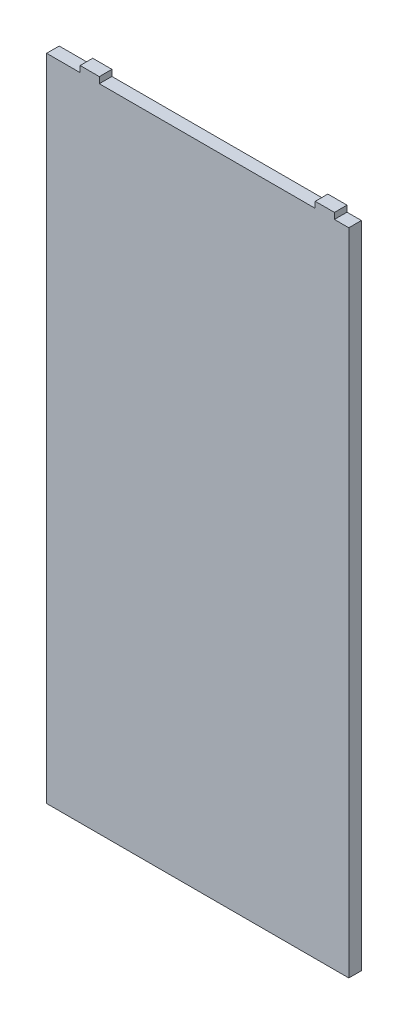
ISO-10303-21;
HEADER;
FILE_DESCRIPTION(('STEP AP214'),'2;1');
FILE_NAME('part.step','',(''),(''),'','','');
FILE_SCHEMA(('AUTOMOTIVE_DESIGN { 1 0 10303 214 1 1 1 1 }'));
ENDSEC;
DATA;
#1=APPLICATION_CONTEXT('core data for automotive mechanical design processes');
#2=APPLICATION_PROTOCOL_DEFINITION('international standard','automotive_design',2000,#1);
#3=PRODUCT_CONTEXT('',#1,'mechanical');
#4=PRODUCT('Part','Part','',(#3));
#5=PRODUCT_RELATED_PRODUCT_CATEGORY('part','',(#4));
#6=PRODUCT_DEFINITION_FORMATION('','',#4);
#7=PRODUCT_DEFINITION_CONTEXT('part definition',#1,'design');
#8=PRODUCT_DEFINITION('design','',#6,#7);
#9=PRODUCT_DEFINITION_SHAPE('','',#8);
#10=(LENGTH_UNIT() NAMED_UNIT(*) SI_UNIT(.MILLI.,.METRE.));
#11=(NAMED_UNIT(*) PLANE_ANGLE_UNIT() SI_UNIT($,.RADIAN.));
#12=(NAMED_UNIT(*) SI_UNIT($,.STERADIAN.) SOLID_ANGLE_UNIT());
#13=UNCERTAINTY_MEASURE_WITH_UNIT(LENGTH_MEASURE(1.E-05),#10,'distance_accuracy_value','');
#14=(GEOMETRIC_REPRESENTATION_CONTEXT(3) GLOBAL_UNCERTAINTY_ASSIGNED_CONTEXT((#13)) GLOBAL_UNIT_ASSIGNED_CONTEXT((#10,
#11,#12)) REPRESENTATION_CONTEXT('',''));
#15=CARTESIAN_POINT('',(0.,0.,0.));
#16=DIRECTION('',(0.,0.,1.));
#17=DIRECTION('',(1.,0.,0.));
#18=AXIS2_PLACEMENT_3D('',#15,#16,#17);
#19=CARTESIAN_POINT('',(11.9856574683296,25.0529411764706,1.));
#20=DIRECTION('',(0.,-1.,0.));
#21=DIRECTION('',(0.,0.,-1.));
#22=AXIS2_PLACEMENT_3D('',#19,#20,#21);
#23=PLANE('',#22);
#24=DIRECTION('',(-1.,0.,0.));
#25=VECTOR('',#24,1.);
#26=CARTESIAN_POINT('',(11.9856574683296,25.0529411764706,1.));
#27=LINE('',#26,#25);
#28=CARTESIAN_POINT('',(9.31924971913157,25.0529411764706,1.));
#29=VERTEX_POINT('',#28);
#30=CARTESIAN_POINT('',(-7.8277832132447,25.0529411764706,1.));
#31=VERTEX_POINT('',#30);
#32=EDGE_CURVE('E56',#29,#31,#27,.T.);
#33=ORIENTED_EDGE('',*,*,#32,.F.);
#34=DIRECTION('',(0.,0.,-1.));
#35=VECTOR('',#34,1.);
#36=CARTESIAN_POINT('',(9.31924971913157,25.0529411764706,1.));
#37=LINE('',#36,#35);
#38=CARTESIAN_POINT('',(9.31924971913157,25.0529411764706,0.));
#39=VERTEX_POINT('',#38);
#40=EDGE_CURVE('E160',#29,#39,#37,.T.);
#41=ORIENTED_EDGE('',*,*,#40,.T.);
#42=DIRECTION('',(-1.,0.,0.));
#43=VECTOR('',#42,1.);
#44=CARTESIAN_POINT('',(11.9856574683296,25.0529411764706,0.));
#45=LINE('',#44,#43);
#46=CARTESIAN_POINT('',(-7.8277832132447,25.0529411764706,0.));
#47=VERTEX_POINT('',#46);
#48=EDGE_CURVE('E149',#39,#47,#45,.T.);
#49=ORIENTED_EDGE('',*,*,#48,.T.);
#50=DIRECTION('',(0.,0.,1.));
#51=VECTOR('',#50,1.);
#52=CARTESIAN_POINT('',(-7.8277832132447,25.0529411764706,1.));
#53=LINE('',#52,#51);
#54=EDGE_CURVE('E200',#47,#31,#53,.T.);
#55=ORIENTED_EDGE('',*,*,#54,.T.);
#56=EDGE_LOOP('',(#33,#41,#49,#55));
#57=FACE_BOUND('',#56,.T.);
#58=ADVANCED_FACE('F33',(#57),#23,.F.);
#59=CARTESIAN_POINT('',(-9.3523252032447,25.0529411764706,1.));
#60=VERTEX_POINT('',#59);
#61=CARTESIAN_POINT('',(-12.0143425316704,25.0529411764706,1.));
#62=VERTEX_POINT('',#61);
#63=EDGE_CURVE('E209',#60,#62,#27,.T.);
#64=ORIENTED_EDGE('',*,*,#63,.F.);
#65=DIRECTION('',(0.,0.,-1.));
#66=VECTOR('',#65,1.);
#67=CARTESIAN_POINT('',(-9.3523252032447,25.0529411764706,1.));
#68=LINE('',#67,#66);
#69=CARTESIAN_POINT('',(-9.3523252032447,25.0529411764706,0.));
#70=VERTEX_POINT('',#69);
#71=EDGE_CURVE('E203',#60,#70,#68,.T.);
#72=ORIENTED_EDGE('',*,*,#71,.T.);
#73=CARTESIAN_POINT('',(-12.0143425316704,25.0529411764706,0.));
#74=VERTEX_POINT('',#73);
#75=EDGE_CURVE('E151',#70,#74,#45,.T.);
#76=ORIENTED_EDGE('',*,*,#75,.T.);
#77=DIRECTION('',(0.,0.,-1.));
#78=VECTOR('',#77,1.);
#79=CARTESIAN_POINT('',(-12.0143425316704,25.0529411764706,1.));
#80=LINE('',#79,#78);
#81=EDGE_CURVE('E41',#62,#74,#80,.T.);
#82=ORIENTED_EDGE('',*,*,#81,.F.);
#83=EDGE_LOOP('',(#64,#72,#76,#82));
#84=FACE_BOUND('',#83,.T.);
#85=ADVANCED_FACE('F235',(#84),#23,.F.);
#86=CARTESIAN_POINT('',(11.9856574683296,25.0529411764706,0.));
#87=VERTEX_POINT('',#86);
#88=CARTESIAN_POINT('',(10.8437917091316,25.0529411764706,0.));
#89=VERTEX_POINT('',#88);
#90=EDGE_CURVE('E138',#87,#89,#45,.T.);
#91=ORIENTED_EDGE('',*,*,#90,.T.);
#92=DIRECTION('',(0.,0.,1.));
#93=VECTOR('',#92,1.);
#94=CARTESIAN_POINT('',(10.8437917091316,25.0529411764706,1.));
#95=LINE('',#94,#93);
#96=CARTESIAN_POINT('',(10.8437917091316,25.0529411764706,1.));
#97=VERTEX_POINT('',#96);
#98=EDGE_CURVE('E141',#89,#97,#95,.T.);
#99=ORIENTED_EDGE('',*,*,#98,.T.);
#100=CARTESIAN_POINT('',(11.9856574683296,25.0529411764706,1.));
#101=VERTEX_POINT('',#100);
#102=EDGE_CURVE('E206',#101,#97,#27,.T.);
#103=ORIENTED_EDGE('',*,*,#102,.F.);
#104=DIRECTION('',(0.,0.,-1.));
#105=VECTOR('',#104,1.);
#106=CARTESIAN_POINT('',(11.9856574683296,25.0529411764706,1.));
#107=LINE('',#106,#105);
#108=EDGE_CURVE('E144',#101,#87,#107,.T.);
#109=ORIENTED_EDGE('',*,*,#108,.T.);
#110=EDGE_LOOP('',(#91,#99,#103,#109));
#111=FACE_BOUND('',#110,.T.);
#112=ADVANCED_FACE('F35',(#111),#23,.F.);
#113=CARTESIAN_POINT('',(-12.0143425316704,25.0529411764706,1.));
#114=DIRECTION('',(1.,0.,0.));
#115=DIRECTION('',(0.,0.,-1.));
#116=AXIS2_PLACEMENT_3D('',#113,#114,#115);
#117=PLANE('',#116);
#118=DIRECTION('',(0.,-1.,0.));
#119=VECTOR('',#118,1.);
#120=CARTESIAN_POINT('',(-12.0143425316704,25.0529411764706,0.));
#121=LINE('',#120,#119);
#122=CARTESIAN_POINT('',(-12.0143425316704,-26.5470588235294,0.));
#123=VERTEX_POINT('',#122);
#124=EDGE_CURVE('E148',#74,#123,#121,.T.);
#125=ORIENTED_EDGE('',*,*,#124,.T.);
#126=DIRECTION('',(0.,0.,-1.));
#127=VECTOR('',#126,1.);
#128=CARTESIAN_POINT('',(-12.0143425316704,-26.5470588235294,1.));
#129=LINE('',#128,#127);
#130=CARTESIAN_POINT('',(-12.0143425316704,-26.5470588235294,1.));
#131=VERTEX_POINT('',#130);
#132=EDGE_CURVE('E225',#131,#123,#129,.T.);
#133=ORIENTED_EDGE('',*,*,#132,.F.);
#134=DIRECTION('',(0.,-1.,0.));
#135=VECTOR('',#134,1.);
#136=CARTESIAN_POINT('',(-12.0143425316704,25.0529411764706,1.));
#137=LINE('',#136,#135);
#138=EDGE_CURVE('E208',#62,#131,#137,.T.);
#139=ORIENTED_EDGE('',*,*,#138,.F.);
#140=ORIENTED_EDGE('',*,*,#81,.T.);
#141=EDGE_LOOP('',(#125,#133,#139,#140));
#142=FACE_BOUND('',#141,.T.);
#143=ADVANCED_FACE('F231',(#142),#117,.F.);
#144=CARTESIAN_POINT('',(-12.0143425316704,-26.5470588235294,1.));
#145=DIRECTION('',(0.,1.,0.));
#146=DIRECTION('',(0.,0.,1.));
#147=AXIS2_PLACEMENT_3D('',#144,#145,#146);
#148=PLANE('',#147);
#149=DIRECTION('',(-1.,0.,0.));
#150=VECTOR('',#149,1.);
#151=CARTESIAN_POINT('',(0.,-26.5470588235294,0.5));
#152=LINE('',#151,#150);
#153=CARTESIAN_POINT('',(3.3832846203628,-26.5470588235294,0.5));
#154=VERTEX_POINT('',#153);
#155=CARTESIAN_POINT('',(-3.54401457519976,-26.5470588235294,0.5));
#156=VERTEX_POINT('',#155);
#157=EDGE_CURVE('E275',#154,#156,#152,.T.);
#158=ORIENTED_EDGE('',*,*,#157,.F.);
#159=DIRECTION('',(0.,0.,-1.));
#160=VECTOR('',#159,1.);
#161=CARTESIAN_POINT('',(3.3832846203628,-26.5470588235294,0.5));
#162=LINE('',#161,#160);
#163=CARTESIAN_POINT('',(3.3832846203628,-26.5470588235294,0.));
#164=VERTEX_POINT('',#163);
#165=EDGE_CURVE('E72',#154,#164,#162,.T.);
#166=ORIENTED_EDGE('',*,*,#165,.T.);
#167=DIRECTION('',(1.,0.,0.));
#168=VECTOR('',#167,1.);
#169=CARTESIAN_POINT('',(-12.0143425316704,-26.5470588235294,0.));
#170=LINE('',#169,#168);
#171=CARTESIAN_POINT('',(11.9856574683296,-26.5470588235294,0.));
#172=VERTEX_POINT('',#171);
#173=EDGE_CURVE('E216',#164,#172,#170,.T.);
#174=ORIENTED_EDGE('',*,*,#173,.T.);
#175=DIRECTION('',(0.,0.,-1.));
#176=VECTOR('',#175,1.);
#177=CARTESIAN_POINT('',(11.9856574683296,-26.5470588235294,1.));
#178=LINE('',#177,#176);
#179=CARTESIAN_POINT('',(11.9856574683296,-26.5470588235294,1.));
#180=VERTEX_POINT('',#179);
#181=EDGE_CURVE('E222',#180,#172,#178,.T.);
#182=ORIENTED_EDGE('',*,*,#181,.F.);
#183=DIRECTION('',(1.,0.,0.));
#184=VECTOR('',#183,1.);
#185=CARTESIAN_POINT('',(-12.0143425316704,-26.5470588235294,1.));
#186=LINE('',#185,#184);
#187=EDGE_CURVE('E211',#131,#180,#186,.T.);
#188=ORIENTED_EDGE('',*,*,#187,.F.);
#189=ORIENTED_EDGE('',*,*,#132,.T.);
#190=CARTESIAN_POINT('',(-3.54401457519976,-26.5470588235294,0.));
#191=VERTEX_POINT('',#190);
#192=EDGE_CURVE('E218',#123,#191,#170,.T.);
#193=ORIENTED_EDGE('',*,*,#192,.T.);
#194=DIRECTION('',(0.,0.,-1.));
#195=VECTOR('',#194,1.);
#196=CARTESIAN_POINT('',(-3.54401457519976,-26.5470588235294,0.5));
#197=LINE('',#196,#195);
#198=EDGE_CURVE('E48',#156,#191,#197,.T.);
#199=ORIENTED_EDGE('',*,*,#198,.F.);
#200=EDGE_LOOP('',(#158,#166,#174,#182,#188,#189,#193,#199));
#201=FACE_BOUND('',#200,.T.);
#202=ADVANCED_FACE('F242',(#201),#148,.F.);
#203=CARTESIAN_POINT('',(11.9856574683296,-26.5470588235294,1.));
#204=DIRECTION('',(-1.,0.,0.));
#205=DIRECTION('',(0.,0.,1.));
#206=AXIS2_PLACEMENT_3D('',#203,#204,#205);
#207=PLANE('',#206);
#208=DIRECTION('',(0.,1.,0.));
#209=VECTOR('',#208,1.);
#210=CARTESIAN_POINT('',(11.9856574683296,-26.5470588235294,0.));
#211=LINE('',#210,#209);
#212=EDGE_CURVE('E219',#172,#87,#211,.T.);
#213=ORIENTED_EDGE('',*,*,#212,.T.);
#214=ORIENTED_EDGE('',*,*,#108,.F.);
#215=DIRECTION('',(0.,1.,0.));
#216=VECTOR('',#215,1.);
#217=CARTESIAN_POINT('',(11.9856574683296,-26.5470588235294,1.));
#218=LINE('',#217,#216);
#219=EDGE_CURVE('E213',#180,#101,#218,.T.);
#220=ORIENTED_EDGE('',*,*,#219,.F.);
#221=ORIENTED_EDGE('',*,*,#181,.T.);
#222=EDGE_LOOP('',(#213,#214,#220,#221));
#223=FACE_BOUND('',#222,.T.);
#224=ADVANCED_FACE('F301',(#223),#207,.F.);
#225=CARTESIAN_POINT('',(0.,0.,1.));
#226=DIRECTION('',(0.,0.,1.));
#227=DIRECTION('',(1.,0.,0.));
#228=AXIS2_PLACEMENT_3D('',#225,#226,#227);
#229=PLANE('',#228);
#230=ORIENTED_EDGE('',*,*,#102,.T.);
#231=DIRECTION('',(0.,-1.,0.));
#232=VECTOR('',#231,1.);
#233=CARTESIAN_POINT('',(10.8437917091316,25.5382672374227,1.));
#234=LINE('',#233,#232);
#235=CARTESIAN_POINT('',(10.8437917091316,25.5382672374227,1.));
#236=VERTEX_POINT('',#235);
#237=EDGE_CURVE('E159',#236,#97,#234,.T.);
#238=ORIENTED_EDGE('',*,*,#237,.F.);
#239=DIRECTION('',(1.,0.,0.));
#240=VECTOR('',#239,1.);
#241=CARTESIAN_POINT('',(10.8437917091316,25.5382672374227,1.));
#242=LINE('',#241,#240);
#243=CARTESIAN_POINT('',(9.31924971913157,25.5382672374227,1.));
#244=VERTEX_POINT('',#243);
#245=EDGE_CURVE('E169',#244,#236,#242,.T.);
#246=ORIENTED_EDGE('',*,*,#245,.F.);
#247=DIRECTION('',(0.,1.,0.));
#248=VECTOR('',#247,1.);
#249=CARTESIAN_POINT('',(9.31924971913157,24.8504445174227,1.));
#250=LINE('',#249,#248);
#251=EDGE_CURVE('E167',#29,#244,#250,.T.);
#252=ORIENTED_EDGE('',*,*,#251,.F.);
#253=ORIENTED_EDGE('',*,*,#32,.T.);
#254=DIRECTION('',(0.,-1.,0.));
#255=VECTOR('',#254,1.);
#256=CARTESIAN_POINT('',(-7.8277832132447,24.8550977876744,1.));
#257=LINE('',#256,#255);
#258=CARTESIAN_POINT('',(-7.8277832132447,25.5429205076744,1.));
#259=VERTEX_POINT('',#258);
#260=EDGE_CURVE('E184',#259,#31,#257,.T.);
#261=ORIENTED_EDGE('',*,*,#260,.F.);
#262=DIRECTION('',(1.,0.,0.));
#263=VECTOR('',#262,1.);
#264=CARTESIAN_POINT('',(-7.8277832132447,25.5429205076744,1.));
#265=LINE('',#264,#263);
#266=CARTESIAN_POINT('',(-9.3523252032447,25.5429205076744,1.));
#267=VERTEX_POINT('',#266);
#268=EDGE_CURVE('E181',#267,#259,#265,.T.);
#269=ORIENTED_EDGE('',*,*,#268,.F.);
#270=DIRECTION('',(0.,1.,0.));
#271=VECTOR('',#270,1.);
#272=CARTESIAN_POINT('',(-9.3523252032447,24.8550977876744,1.));
#273=LINE('',#272,#271);
#274=EDGE_CURVE('E188',#60,#267,#273,.T.);
#275=ORIENTED_EDGE('',*,*,#274,.F.);
#276=ORIENTED_EDGE('',*,*,#63,.T.);
#277=ORIENTED_EDGE('',*,*,#138,.T.);
#278=ORIENTED_EDGE('',*,*,#187,.T.);
#279=ORIENTED_EDGE('',*,*,#219,.T.);
#280=EDGE_LOOP('',(#230,#238,#246,#252,#253,#261,#269,#275,#276,#277,#278,#279));
#281=FACE_BOUND('',#280,.T.);
#282=ADVANCED_FACE('F247',(#281),#229,.T.);
#283=CARTESIAN_POINT('',(0.,0.,0.));
#284=DIRECTION('',(0.,0.,1.));
#285=DIRECTION('',(1.,0.,0.));
#286=AXIS2_PLACEMENT_3D('',#283,#284,#285);
#287=PLANE('',#286);
#288=ORIENTED_EDGE('',*,*,#173,.F.);
#289=CARTESIAN_POINT('',(-0.0803649774184789,-26.5562970544556,0.));
#290=DIRECTION('',(0.,0.,-1.));
#291=DIRECTION('',(-1.,0.,0.));
#292=AXIS2_PLACEMENT_3D('',#289,#290,#291);
#293=CIRCLE('',#292,3.46366191784376);
#294=EDGE_CURVE('E11',#164,#191,#293,.F.);
#295=ORIENTED_EDGE('',*,*,#294,.T.);
#296=ORIENTED_EDGE('',*,*,#192,.F.);
#297=ORIENTED_EDGE('',*,*,#124,.F.);
#298=ORIENTED_EDGE('',*,*,#75,.F.);
#299=DIRECTION('',(0.,1.,0.));
#300=VECTOR('',#299,1.);
#301=CARTESIAN_POINT('',(-9.3523252032447,24.8550977876744,0.));
#302=LINE('',#301,#300);
#303=CARTESIAN_POINT('',(-9.3523252032447,25.5429205076744,0.));
#304=VERTEX_POINT('',#303);
#305=EDGE_CURVE('E185',#70,#304,#302,.T.);
#306=ORIENTED_EDGE('',*,*,#305,.T.);
#307=DIRECTION('',(1.,0.,0.));
#308=VECTOR('',#307,1.);
#309=CARTESIAN_POINT('',(-7.8277832132447,25.5429205076744,0.));
#310=LINE('',#309,#308);
#311=CARTESIAN_POINT('',(-7.8277832132447,25.5429205076744,0.));
#312=VERTEX_POINT('',#311);
#313=EDGE_CURVE('E180',#304,#312,#310,.T.);
#314=ORIENTED_EDGE('',*,*,#313,.T.);
#315=DIRECTION('',(0.,-1.,0.));
#316=VECTOR('',#315,1.);
#317=CARTESIAN_POINT('',(-7.8277832132447,24.8550977876744,0.));
#318=LINE('',#317,#316);
#319=EDGE_CURVE('E193',#312,#47,#318,.T.);
#320=ORIENTED_EDGE('',*,*,#319,.T.);
#321=ORIENTED_EDGE('',*,*,#48,.F.);
#322=DIRECTION('',(0.,1.,0.));
#323=VECTOR('',#322,1.);
#324=CARTESIAN_POINT('',(9.31924971913157,24.8504445174227,0.));
#325=LINE('',#324,#323);
#326=CARTESIAN_POINT('',(9.31924971913157,25.5382672374227,0.));
#327=VERTEX_POINT('',#326);
#328=EDGE_CURVE('E171',#39,#327,#325,.T.);
#329=ORIENTED_EDGE('',*,*,#328,.T.);
#330=DIRECTION('',(1.,0.,0.));
#331=VECTOR('',#330,1.);
#332=CARTESIAN_POINT('',(10.8437917091316,25.5382672374227,0.));
#333=LINE('',#332,#331);
#334=CARTESIAN_POINT('',(10.8437917091316,25.5382672374227,0.));
#335=VERTEX_POINT('',#334);
#336=EDGE_CURVE('E166',#327,#335,#333,.T.);
#337=ORIENTED_EDGE('',*,*,#336,.T.);
#338=DIRECTION('',(0.,-1.,0.));
#339=VECTOR('',#338,1.);
#340=CARTESIAN_POINT('',(10.8437917091316,25.5382672374227,0.));
#341=LINE('',#340,#339);
#342=EDGE_CURVE('E156',#335,#89,#341,.T.);
#343=ORIENTED_EDGE('',*,*,#342,.T.);
#344=ORIENTED_EDGE('',*,*,#90,.F.);
#345=ORIENTED_EDGE('',*,*,#212,.F.);
#346=EDGE_LOOP('',(#288,#295,#296,#297,#298,#306,#314,#320,#321,#329,#337,#343,#344,#345));
#347=FACE_BOUND('',#346,.T.);
#348=ADVANCED_FACE('F164',(#347),#287,.F.);
#349=CARTESIAN_POINT('',(-9.3523252032447,24.8550977876744,1.));
#350=DIRECTION('',(-1.,0.,0.));
#351=DIRECTION('',(0.,0.,1.));
#352=AXIS2_PLACEMENT_3D('',#349,#350,#351);
#353=PLANE('',#352);
#354=ORIENTED_EDGE('',*,*,#71,.F.);
#355=ORIENTED_EDGE('',*,*,#274,.T.);
#356=DIRECTION('',(0.,0.,-1.));
#357=VECTOR('',#356,1.);
#358=CARTESIAN_POINT('',(-9.3523252032447,25.5429205076744,1.));
#359=LINE('',#358,#357);
#360=EDGE_CURVE('E197',#267,#304,#359,.T.);
#361=ORIENTED_EDGE('',*,*,#360,.T.);
#362=ORIENTED_EDGE('',*,*,#305,.F.);
#363=EDGE_LOOP('',(#354,#355,#361,#362));
#364=FACE_BOUND('',#363,.T.);
#365=ADVANCED_FACE('F262',(#364),#353,.T.);
#366=CARTESIAN_POINT('',(-7.8277832132447,24.8550977876744,1.));
#367=DIRECTION('',(1.,0.,0.));
#368=DIRECTION('',(0.,0.,-1.));
#369=AXIS2_PLACEMENT_3D('',#366,#367,#368);
#370=PLANE('',#369);
#371=ORIENTED_EDGE('',*,*,#54,.F.);
#372=ORIENTED_EDGE('',*,*,#319,.F.);
#373=DIRECTION('',(0.,0.,-1.));
#374=VECTOR('',#373,1.);
#375=CARTESIAN_POINT('',(-7.8277832132447,25.5429205076744,1.));
#376=LINE('',#375,#374);
#377=EDGE_CURVE('E190',#259,#312,#376,.T.);
#378=ORIENTED_EDGE('',*,*,#377,.F.);
#379=ORIENTED_EDGE('',*,*,#260,.T.);
#380=EDGE_LOOP('',(#371,#372,#378,#379));
#381=FACE_BOUND('',#380,.T.);
#382=ADVANCED_FACE('F256',(#381),#370,.T.);
#383=CARTESIAN_POINT('',(-7.8277832132447,25.5429205076744,1.));
#384=DIRECTION('',(0.,1.,0.));
#385=DIRECTION('',(0.,0.,1.));
#386=AXIS2_PLACEMENT_3D('',#383,#384,#385);
#387=PLANE('',#386);
#388=ORIENTED_EDGE('',*,*,#313,.F.);
#389=ORIENTED_EDGE('',*,*,#360,.F.);
#390=ORIENTED_EDGE('',*,*,#268,.T.);
#391=ORIENTED_EDGE('',*,*,#377,.T.);
#392=EDGE_LOOP('',(#388,#389,#390,#391));
#393=FACE_BOUND('',#392,.T.);
#394=ADVANCED_FACE('F259',(#393),#387,.T.);
#395=CARTESIAN_POINT('',(9.31924971913157,24.8504445174227,1.));
#396=DIRECTION('',(-1.,0.,0.));
#397=DIRECTION('',(0.,0.,1.));
#398=AXIS2_PLACEMENT_3D('',#395,#396,#397);
#399=PLANE('',#398);
#400=ORIENTED_EDGE('',*,*,#40,.F.);
#401=ORIENTED_EDGE('',*,*,#251,.T.);
#402=DIRECTION('',(0.,0.,-1.));
#403=VECTOR('',#402,1.);
#404=CARTESIAN_POINT('',(9.31924971913157,25.5382672374227,1.));
#405=LINE('',#404,#403);
#406=EDGE_CURVE('E176',#244,#327,#405,.T.);
#407=ORIENTED_EDGE('',*,*,#406,.T.);
#408=ORIENTED_EDGE('',*,*,#328,.F.);
#409=EDGE_LOOP('',(#400,#401,#407,#408));
#410=FACE_BOUND('',#409,.T.);
#411=ADVANCED_FACE('F265',(#410),#399,.T.);
#412=CARTESIAN_POINT('',(10.8437917091316,25.5382672374227,1.));
#413=DIRECTION('',(1.,0.,0.));
#414=DIRECTION('',(0.,0.,-1.));
#415=AXIS2_PLACEMENT_3D('',#412,#413,#414);
#416=PLANE('',#415);
#417=ORIENTED_EDGE('',*,*,#98,.F.);
#418=ORIENTED_EDGE('',*,*,#342,.F.);
#419=DIRECTION('',(0.,0.,-1.));
#420=VECTOR('',#419,1.);
#421=CARTESIAN_POINT('',(10.8437917091316,25.5382672374227,1.));
#422=LINE('',#421,#420);
#423=EDGE_CURVE('E161',#236,#335,#422,.T.);
#424=ORIENTED_EDGE('',*,*,#423,.F.);
#425=ORIENTED_EDGE('',*,*,#237,.T.);
#426=EDGE_LOOP('',(#417,#418,#424,#425));
#427=FACE_BOUND('',#426,.T.);
#428=ADVANCED_FACE('F155',(#427),#416,.T.);
#429=CARTESIAN_POINT('',(10.8437917091316,25.5382672374227,1.));
#430=DIRECTION('',(0.,1.,0.));
#431=DIRECTION('',(0.,0.,1.));
#432=AXIS2_PLACEMENT_3D('',#429,#430,#431);
#433=PLANE('',#432);
#434=ORIENTED_EDGE('',*,*,#336,.F.);
#435=ORIENTED_EDGE('',*,*,#406,.F.);
#436=ORIENTED_EDGE('',*,*,#245,.T.);
#437=ORIENTED_EDGE('',*,*,#423,.T.);
#438=EDGE_LOOP('',(#434,#435,#436,#437));
#439=FACE_BOUND('',#438,.T.);
#440=ADVANCED_FACE('F280',(#439),#433,.T.);
#441=CARTESIAN_POINT('',(-0.0803649774184789,-26.5562970544556,0.5));
#442=DIRECTION('',(0.,0.,-1.));
#443=DIRECTION('',(-1.,0.,0.));
#444=AXIS2_PLACEMENT_3D('',#441,#442,#443);
#445=CYLINDRICAL_SURFACE('',#444,3.46366191784376);
#446=ORIENTED_EDGE('',*,*,#165,.F.);
#447=CARTESIAN_POINT('',(-0.0803649774184789,-26.5562970544556,0.5));
#448=DIRECTION('',(0.,0.,-1.));
#449=DIRECTION('',(-1.,0.,0.));
#450=AXIS2_PLACEMENT_3D('',#447,#448,#449);
#451=CIRCLE('',#450,3.46366191784376);
#452=EDGE_CURVE('E273',#156,#154,#451,.T.);
#453=ORIENTED_EDGE('',*,*,#452,.F.);
#454=ORIENTED_EDGE('',*,*,#198,.T.);
#455=ORIENTED_EDGE('',*,*,#294,.F.);
#456=EDGE_LOOP('',(#446,#453,#454,#455));
#457=FACE_BOUND('',#456,.T.);
#458=ADVANCED_FACE('F278',(#457),#445,.F.);
#459=CARTESIAN_POINT('',(0.,0.,0.5));
#460=DIRECTION('',(0.,0.,-1.));
#461=DIRECTION('',(-1.,0.,0.));
#462=AXIS2_PLACEMENT_3D('',#459,#460,#461);
#463=PLANE('',#462);
#464=ORIENTED_EDGE('',*,*,#157,.T.);
#465=ORIENTED_EDGE('',*,*,#452,.T.);
#466=EDGE_LOOP('',(#464,#465));
#467=FACE_BOUND('',#466,.T.);
#468=ADVANCED_FACE('F277',(#467),#463,.T.);
#469=CLOSED_SHELL('',(#58,#85,#112,#143,#202,#224,#282,#348,#365,#382,#394,#411,#428,#440,#458,#468));
#470=MANIFOLD_SOLID_BREP('B2',#469);
#471=ADVANCED_BREP_SHAPE_REPRESENTATION('',(#18,#470),#14);
#472=SHAPE_DEFINITION_REPRESENTATION(#9,#471);
ENDSEC;
END-ISO-10303-21;
